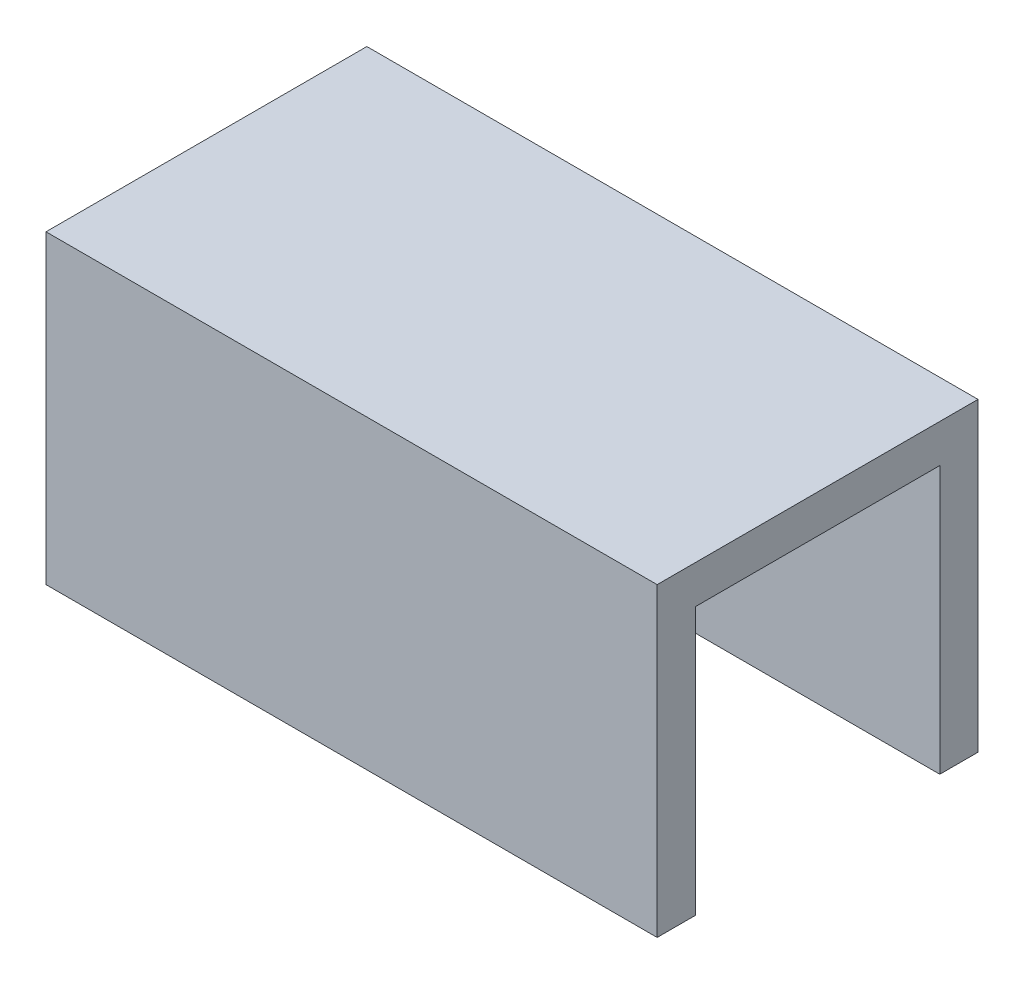
ISO-10303-21;
HEADER;
FILE_DESCRIPTION(('STEP AP214'),'2;1');
FILE_NAME('part.step','',(''),(''),'','','');
FILE_SCHEMA(('AUTOMOTIVE_DESIGN { 1 0 10303 214 1 1 1 1 }'));
ENDSEC;
DATA;
#1=APPLICATION_CONTEXT('core data for automotive mechanical design processes');
#2=APPLICATION_PROTOCOL_DEFINITION('international standard','automotive_design',2000,#1);
#3=PRODUCT_CONTEXT('',#1,'mechanical');
#4=PRODUCT('Part','Part','',(#3));
#5=PRODUCT_RELATED_PRODUCT_CATEGORY('part','',(#4));
#6=PRODUCT_DEFINITION_FORMATION('','',#4);
#7=PRODUCT_DEFINITION_CONTEXT('part definition',#1,'design');
#8=PRODUCT_DEFINITION('design','',#6,#7);
#9=PRODUCT_DEFINITION_SHAPE('','',#8);
#10=(LENGTH_UNIT() NAMED_UNIT(*) SI_UNIT(.MILLI.,.METRE.));
#11=(NAMED_UNIT(*) PLANE_ANGLE_UNIT() SI_UNIT($,.RADIAN.));
#12=(NAMED_UNIT(*) SI_UNIT($,.STERADIAN.) SOLID_ANGLE_UNIT());
#13=UNCERTAINTY_MEASURE_WITH_UNIT(LENGTH_MEASURE(1.E-05),#10,'distance_accuracy_value','');
#14=(GEOMETRIC_REPRESENTATION_CONTEXT(3) GLOBAL_UNCERTAINTY_ASSIGNED_CONTEXT((#13)) GLOBAL_UNIT_ASSIGNED_CONTEXT((#10,
#11,#12)) REPRESENTATION_CONTEXT('',''));
#15=CARTESIAN_POINT('',(0.,0.,0.));
#16=DIRECTION('',(0.,0.,1.));
#17=DIRECTION('',(1.,0.,0.));
#18=AXIS2_PLACEMENT_3D('',#15,#16,#17);
#19=CARTESIAN_POINT('',(20.,0.,10.5));
#20=DIRECTION('',(0.,1.,0.));
#21=DIRECTION('',(0.,0.,1.));
#22=AXIS2_PLACEMENT_3D('',#19,#20,#21);
#23=PLANE('',#22);
#24=DIRECTION('',(0.,0.,-1.));
#25=VECTOR('',#24,1.);
#26=CARTESIAN_POINT('',(-20.,0.,10.5));
#27=LINE('',#26,#25);
#28=CARTESIAN_POINT('',(-20.,0.,10.5));
#29=VERTEX_POINT('',#28);
#30=CARTESIAN_POINT('',(-20.,0.,8.));
#31=VERTEX_POINT('',#30);
#32=EDGE_CURVE('E145',#29,#31,#27,.T.);
#33=ORIENTED_EDGE('',*,*,#32,.T.);
#34=DIRECTION('',(-1.,0.,0.));
#35=VECTOR('',#34,1.);
#36=CARTESIAN_POINT('',(20.,0.,8.));
#37=LINE('',#36,#35);
#38=CARTESIAN_POINT('',(20.,0.,8.));
#39=VERTEX_POINT('',#38);
#40=EDGE_CURVE('E11',#39,#31,#37,.T.);
#41=ORIENTED_EDGE('',*,*,#40,.F.);
#42=DIRECTION('',(0.,0.,-1.));
#43=VECTOR('',#42,1.);
#44=CARTESIAN_POINT('',(20.,0.,10.5));
#45=LINE('',#44,#43);
#46=CARTESIAN_POINT('',(20.,0.,10.5));
#47=VERTEX_POINT('',#46);
#48=EDGE_CURVE('E169',#47,#39,#45,.T.);
#49=ORIENTED_EDGE('',*,*,#48,.F.);
#50=DIRECTION('',(-1.,0.,0.));
#51=VECTOR('',#50,1.);
#52=CARTESIAN_POINT('',(20.,0.,10.5));
#53=LINE('',#52,#51);
#54=EDGE_CURVE('E141',#47,#29,#53,.T.);
#55=ORIENTED_EDGE('',*,*,#54,.T.);
#56=EDGE_LOOP('',(#33,#41,#49,#55));
#57=FACE_BOUND('',#56,.T.);
#58=ADVANCED_FACE('F45',(#57),#23,.F.);
#59=CARTESIAN_POINT('',(20.,0.,8.));
#60=DIRECTION('',(0.,0.,1.));
#61=DIRECTION('',(1.,0.,0.));
#62=AXIS2_PLACEMENT_3D('',#59,#60,#61);
#63=PLANE('',#62);
#64=CARTESIAN_POINT('',(0.,40.3571428571429,8.));
#65=DIRECTION('',(0.,0.,-1.));
#66=DIRECTION('',(-1.,0.,0.));
#67=AXIS2_PLACEMENT_3D('',#64,#65,#66);
#68=CIRCLE('',#67,30.3718451792419);
#69=CARTESIAN_POINT('',(20.,17.5,8.));
#70=VERTEX_POINT('',#69);
#71=CARTESIAN_POINT('',(-20.,17.5,8.));
#72=VERTEX_POINT('',#71);
#73=EDGE_CURVE('E150',#70,#72,#68,.T.);
#74=ORIENTED_EDGE('',*,*,#73,.F.);
#75=DIRECTION('',(0.,1.,0.));
#76=VECTOR('',#75,1.);
#77=CARTESIAN_POINT('',(20.,0.,8.));
#78=LINE('',#77,#76);
#79=EDGE_CURVE('E103',#39,#70,#78,.T.);
#80=ORIENTED_EDGE('',*,*,#79,.F.);
#81=ORIENTED_EDGE('',*,*,#40,.T.);
#82=DIRECTION('',(0.,1.,0.));
#83=VECTOR('',#82,1.);
#84=CARTESIAN_POINT('',(-20.,0.,8.));
#85=LINE('',#84,#83);
#86=EDGE_CURVE('E149',#31,#72,#85,.T.);
#87=ORIENTED_EDGE('',*,*,#86,.T.);
#88=EDGE_LOOP('',(#74,#80,#81,#87));
#89=FACE_BOUND('',#88,.T.);
#90=ADVANCED_FACE('F204',(#89),#63,.F.);
#91=CARTESIAN_POINT('',(20.,17.5,-8.));
#92=DIRECTION('',(0.,0.,-1.));
#93=DIRECTION('',(-1.,0.,0.));
#94=AXIS2_PLACEMENT_3D('',#91,#92,#93);
#95=PLANE('',#94);
#96=CARTESIAN_POINT('',(0.,40.3571428571429,-8.));
#97=DIRECTION('',(0.,0.,-1.));
#98=DIRECTION('',(-1.,0.,0.));
#99=AXIS2_PLACEMENT_3D('',#96,#97,#98);
#100=CIRCLE('',#99,30.3718451792419);
#101=CARTESIAN_POINT('',(20.,17.5,-8.));
#102=VERTEX_POINT('',#101);
#103=CARTESIAN_POINT('',(-20.,17.5,-8.));
#104=VERTEX_POINT('',#103);
#105=EDGE_CURVE('E258',#102,#104,#100,.T.);
#106=ORIENTED_EDGE('',*,*,#105,.T.);
#107=DIRECTION('',(0.,-1.,0.));
#108=VECTOR('',#107,1.);
#109=CARTESIAN_POINT('',(-20.,17.5,-8.));
#110=LINE('',#109,#108);
#111=CARTESIAN_POINT('',(-20.,0.,-8.));
#112=VERTEX_POINT('',#111);
#113=EDGE_CURVE('E157',#104,#112,#110,.T.);
#114=ORIENTED_EDGE('',*,*,#113,.T.);
#115=DIRECTION('',(-1.,0.,0.));
#116=VECTOR('',#115,1.);
#117=CARTESIAN_POINT('',(20.,0.,-8.));
#118=LINE('',#117,#116);
#119=CARTESIAN_POINT('',(20.,0.,-8.));
#120=VERTEX_POINT('',#119);
#121=EDGE_CURVE('E54',#120,#112,#118,.T.);
#122=ORIENTED_EDGE('',*,*,#121,.F.);
#123=DIRECTION('',(0.,-1.,0.));
#124=VECTOR('',#123,1.);
#125=CARTESIAN_POINT('',(20.,17.5,-8.));
#126=LINE('',#125,#124);
#127=EDGE_CURVE('E272',#102,#120,#126,.T.);
#128=ORIENTED_EDGE('',*,*,#127,.F.);
#129=EDGE_LOOP('',(#106,#114,#122,#128));
#130=FACE_BOUND('',#129,.T.);
#131=ADVANCED_FACE('F208',(#130),#95,.F.);
#132=CARTESIAN_POINT('',(20.,0.,-8.));
#133=DIRECTION('',(0.,1.,0.));
#134=DIRECTION('',(0.,0.,1.));
#135=AXIS2_PLACEMENT_3D('',#132,#133,#134);
#136=PLANE('',#135);
#137=DIRECTION('',(0.,0.,-1.));
#138=VECTOR('',#137,1.);
#139=CARTESIAN_POINT('',(-20.,0.,-8.));
#140=LINE('',#139,#138);
#141=CARTESIAN_POINT('',(-20.,0.,-10.5));
#142=VERTEX_POINT('',#141);
#143=EDGE_CURVE('E160',#112,#142,#140,.T.);
#144=ORIENTED_EDGE('',*,*,#143,.T.);
#145=DIRECTION('',(-1.,0.,0.));
#146=VECTOR('',#145,1.);
#147=CARTESIAN_POINT('',(20.,0.,-10.5));
#148=LINE('',#147,#146);
#149=CARTESIAN_POINT('',(20.,0.,-10.5));
#150=VERTEX_POINT('',#149);
#151=EDGE_CURVE('E134',#150,#142,#148,.T.);
#152=ORIENTED_EDGE('',*,*,#151,.F.);
#153=DIRECTION('',(0.,0.,-1.));
#154=VECTOR('',#153,1.);
#155=CARTESIAN_POINT('',(20.,0.,-8.));
#156=LINE('',#155,#154);
#157=EDGE_CURVE('E123',#120,#150,#156,.T.);
#158=ORIENTED_EDGE('',*,*,#157,.F.);
#159=ORIENTED_EDGE('',*,*,#121,.T.);
#160=EDGE_LOOP('',(#144,#152,#158,#159));
#161=FACE_BOUND('',#160,.T.);
#162=ADVANCED_FACE('F180',(#161),#136,.F.);
#163=CARTESIAN_POINT('',(20.,0.,-10.5));
#164=DIRECTION('',(0.,0.,1.));
#165=DIRECTION('',(0.,-1.,0.));
#166=AXIS2_PLACEMENT_3D('',#163,#164,#165);
#167=PLANE('',#166);
#168=DIRECTION('',(0.,1.,0.));
#169=VECTOR('',#168,1.);
#170=CARTESIAN_POINT('',(-20.,0.,-10.5));
#171=LINE('',#170,#169);
#172=CARTESIAN_POINT('',(-20.,20.,-10.5));
#173=VERTEX_POINT('',#172);
#174=EDGE_CURVE('E132',#142,#173,#171,.T.);
#175=ORIENTED_EDGE('',*,*,#174,.T.);
#176=DIRECTION('',(-1.,0.,0.));
#177=VECTOR('',#176,1.);
#178=CARTESIAN_POINT('',(20.,20.,-10.5));
#179=LINE('',#178,#177);
#180=CARTESIAN_POINT('',(20.,20.,-10.5));
#181=VERTEX_POINT('',#180);
#182=EDGE_CURVE('E129',#181,#173,#179,.T.);
#183=ORIENTED_EDGE('',*,*,#182,.F.);
#184=DIRECTION('',(0.,1.,0.));
#185=VECTOR('',#184,1.);
#186=CARTESIAN_POINT('',(20.,0.,-10.5));
#187=LINE('',#186,#185);
#188=EDGE_CURVE('E117',#150,#181,#187,.T.);
#189=ORIENTED_EDGE('',*,*,#188,.F.);
#190=ORIENTED_EDGE('',*,*,#151,.T.);
#191=EDGE_LOOP('',(#175,#183,#189,#190));
#192=FACE_BOUND('',#191,.T.);
#193=ADVANCED_FACE('F130',(#192),#167,.F.);
#194=CARTESIAN_POINT('',(20.,20.,-10.5));
#195=DIRECTION('',(0.,-1.,0.));
#196=DIRECTION('',(0.,0.,-1.));
#197=AXIS2_PLACEMENT_3D('',#194,#195,#196);
#198=PLANE('',#197);
#199=DIRECTION('',(0.,0.,1.));
#200=VECTOR('',#199,1.);
#201=CARTESIAN_POINT('',(-20.,20.,-10.5));
#202=LINE('',#201,#200);
#203=CARTESIAN_POINT('',(-20.,20.,10.5));
#204=VERTEX_POINT('',#203);
#205=EDGE_CURVE('E89',#173,#204,#202,.T.);
#206=ORIENTED_EDGE('',*,*,#205,.T.);
#207=DIRECTION('',(-1.,0.,0.));
#208=VECTOR('',#207,1.);
#209=CARTESIAN_POINT('',(20.,20.,10.5));
#210=LINE('',#209,#208);
#211=CARTESIAN_POINT('',(20.,20.,10.5));
#212=VERTEX_POINT('',#211);
#213=EDGE_CURVE('E135',#212,#204,#210,.T.);
#214=ORIENTED_EDGE('',*,*,#213,.F.);
#215=DIRECTION('',(0.,0.,1.));
#216=VECTOR('',#215,1.);
#217=CARTESIAN_POINT('',(20.,20.,-10.5));
#218=LINE('',#217,#216);
#219=EDGE_CURVE('E121',#181,#212,#218,.T.);
#220=ORIENTED_EDGE('',*,*,#219,.F.);
#221=ORIENTED_EDGE('',*,*,#182,.T.);
#222=EDGE_LOOP('',(#206,#214,#220,#221));
#223=FACE_BOUND('',#222,.T.);
#224=ADVANCED_FACE('F137',(#223),#198,.F.);
#225=CARTESIAN_POINT('',(20.,20.,10.5));
#226=DIRECTION('',(0.,0.,-1.));
#227=DIRECTION('',(0.,1.,0.));
#228=AXIS2_PLACEMENT_3D('',#225,#226,#227);
#229=PLANE('',#228);
#230=DIRECTION('',(0.,-1.,0.));
#231=VECTOR('',#230,1.);
#232=CARTESIAN_POINT('',(-20.,20.,10.5));
#233=LINE('',#232,#231);
#234=EDGE_CURVE('E95',#204,#29,#233,.T.);
#235=ORIENTED_EDGE('',*,*,#234,.T.);
#236=ORIENTED_EDGE('',*,*,#54,.F.);
#237=DIRECTION('',(0.,-1.,0.));
#238=VECTOR('',#237,1.);
#239=CARTESIAN_POINT('',(20.,20.,10.5));
#240=LINE('',#239,#238);
#241=EDGE_CURVE('E62',#212,#47,#240,.T.);
#242=ORIENTED_EDGE('',*,*,#241,.F.);
#243=ORIENTED_EDGE('',*,*,#213,.T.);
#244=EDGE_LOOP('',(#235,#236,#242,#243));
#245=FACE_BOUND('',#244,.T.);
#246=ADVANCED_FACE('F192',(#245),#229,.F.);
#247=CARTESIAN_POINT('',(20.,0.,0.));
#248=DIRECTION('',(1.,0.,0.));
#249=DIRECTION('',(0.,0.,-1.));
#250=AXIS2_PLACEMENT_3D('',#247,#248,#249);
#251=PLANE('',#250);
#252=ORIENTED_EDGE('',*,*,#48,.T.);
#253=ORIENTED_EDGE('',*,*,#79,.T.);
#254=DIRECTION('',(0.,0.,-1.));
#255=VECTOR('',#254,1.);
#256=CARTESIAN_POINT('',(20.,17.5,8.));
#257=LINE('',#256,#255);
#258=EDGE_CURVE('E260',#70,#102,#257,.T.);
#259=ORIENTED_EDGE('',*,*,#258,.T.);
#260=ORIENTED_EDGE('',*,*,#127,.T.);
#261=ORIENTED_EDGE('',*,*,#157,.T.);
#262=ORIENTED_EDGE('',*,*,#188,.T.);
#263=ORIENTED_EDGE('',*,*,#219,.T.);
#264=ORIENTED_EDGE('',*,*,#241,.T.);
#265=EDGE_LOOP('',(#252,#253,#259,#260,#261,#262,#263,#264));
#266=FACE_BOUND('',#265,.T.);
#267=ADVANCED_FACE('F119',(#266),#251,.T.);
#268=CARTESIAN_POINT('',(-20.,0.,0.));
#269=DIRECTION('',(1.,0.,0.));
#270=DIRECTION('',(0.,0.,-1.));
#271=AXIS2_PLACEMENT_3D('',#268,#269,#270);
#272=PLANE('',#271);
#273=ORIENTED_EDGE('',*,*,#32,.F.);
#274=ORIENTED_EDGE('',*,*,#234,.F.);
#275=ORIENTED_EDGE('',*,*,#205,.F.);
#276=ORIENTED_EDGE('',*,*,#174,.F.);
#277=ORIENTED_EDGE('',*,*,#143,.F.);
#278=ORIENTED_EDGE('',*,*,#113,.F.);
#279=DIRECTION('',(0.,0.,-1.));
#280=VECTOR('',#279,1.);
#281=CARTESIAN_POINT('',(-20.,17.5,8.));
#282=LINE('',#281,#280);
#283=EDGE_CURVE('E153',#72,#104,#282,.T.);
#284=ORIENTED_EDGE('',*,*,#283,.F.);
#285=ORIENTED_EDGE('',*,*,#86,.F.);
#286=EDGE_LOOP('',(#273,#274,#275,#276,#277,#278,#284,#285));
#287=FACE_BOUND('',#286,.T.);
#288=ADVANCED_FACE('F186',(#287),#272,.F.);
#289=CARTESIAN_POINT('',(0.,40.3571428571429,-10.502));
#290=DIRECTION('',(0.,0.,1.));
#291=DIRECTION('',(1.,0.,0.));
#292=AXIS2_PLACEMENT_3D('',#289,#290,#291);
#293=CYLINDRICAL_SURFACE('',#292,30.3718451792419);
#294=ORIENTED_EDGE('',*,*,#105,.F.);
#295=ORIENTED_EDGE('',*,*,#258,.F.);
#296=ORIENTED_EDGE('',*,*,#73,.T.);
#297=ORIENTED_EDGE('',*,*,#283,.T.);
#298=EDGE_LOOP('',(#294,#295,#296,#297));
#299=FACE_BOUND('',#298,.T.);
#300=ADVANCED_FACE('F245',(#299),#293,.T.);
#301=CLOSED_SHELL('',(#58,#90,#131,#162,#193,#224,#246,#267,#288,#300));
#302=MANIFOLD_SOLID_BREP('B2',#301);
#303=ADVANCED_BREP_SHAPE_REPRESENTATION('',(#18,#302),#14);
#304=SHAPE_DEFINITION_REPRESENTATION(#9,#303);
ENDSEC;
END-ISO-10303-21;
